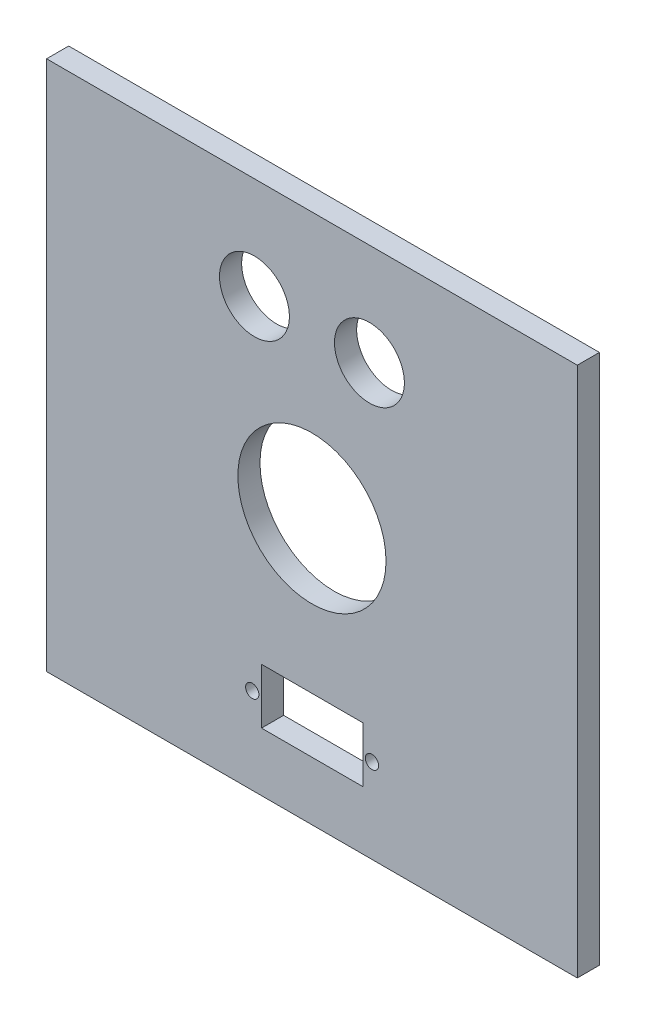
ISO-10303-21;
HEADER;
FILE_DESCRIPTION(('STEP AP214'),'2;1');
FILE_NAME('part.step','',(''),(''),'','','');
FILE_SCHEMA(('AUTOMOTIVE_DESIGN { 1 0 10303 214 1 1 1 1 }'));
ENDSEC;
DATA;
#1=APPLICATION_CONTEXT('core data for automotive mechanical design processes');
#2=APPLICATION_PROTOCOL_DEFINITION('international standard','automotive_design',2000,#1);
#3=PRODUCT_CONTEXT('',#1,'mechanical');
#4=PRODUCT('Part','Part','',(#3));
#5=PRODUCT_RELATED_PRODUCT_CATEGORY('part','',(#4));
#6=PRODUCT_DEFINITION_FORMATION('','',#4);
#7=PRODUCT_DEFINITION_CONTEXT('part definition',#1,'design');
#8=PRODUCT_DEFINITION('design','',#6,#7);
#9=PRODUCT_DEFINITION_SHAPE('','',#8);
#10=(LENGTH_UNIT() NAMED_UNIT(*) SI_UNIT(.MILLI.,.METRE.));
#11=(NAMED_UNIT(*) PLANE_ANGLE_UNIT() SI_UNIT($,.RADIAN.));
#12=(NAMED_UNIT(*) SI_UNIT($,.STERADIAN.) SOLID_ANGLE_UNIT());
#13=UNCERTAINTY_MEASURE_WITH_UNIT(LENGTH_MEASURE(1.E-05),#10,'distance_accuracy_value','');
#14=(GEOMETRIC_REPRESENTATION_CONTEXT(3) GLOBAL_UNCERTAINTY_ASSIGNED_CONTEXT((#13)) GLOBAL_UNIT_ASSIGNED_CONTEXT((#10,
#11,#12)) REPRESENTATION_CONTEXT('',''));
#15=CARTESIAN_POINT('',(0.,0.,0.));
#16=DIRECTION('',(0.,0.,1.));
#17=DIRECTION('',(1.,0.,0.));
#18=AXIS2_PLACEMENT_3D('',#15,#16,#17);
#19=CARTESIAN_POINT('',(0.,0.,5.));
#20=DIRECTION('',(1.,0.,0.));
#21=DIRECTION('',(0.,1.,0.));
#22=AXIS2_PLACEMENT_3D('',#19,#20,#21);
#23=PLANE('',#22);
#24=DIRECTION('',(0.,-1.,0.));
#25=VECTOR('',#24,1.);
#26=CARTESIAN_POINT('',(0.,0.,0.));
#27=LINE('',#26,#25);
#28=CARTESIAN_POINT('',(0.,120.,0.));
#29=VERTEX_POINT('',#28);
#30=CARTESIAN_POINT('',(0.,0.,0.));
#31=VERTEX_POINT('',#30);
#32=EDGE_CURVE('E137',#29,#31,#27,.T.);
#33=ORIENTED_EDGE('',*,*,#32,.T.);
#34=DIRECTION('',(0.,0.,-1.));
#35=VECTOR('',#34,1.);
#36=CARTESIAN_POINT('',(0.,0.,5.));
#37=LINE('',#36,#35);
#38=CARTESIAN_POINT('',(0.,0.,5.));
#39=VERTEX_POINT('',#38);
#40=EDGE_CURVE('E153',#39,#31,#37,.T.);
#41=ORIENTED_EDGE('',*,*,#40,.F.);
#42=DIRECTION('',(0.,-1.,0.));
#43=VECTOR('',#42,1.);
#44=CARTESIAN_POINT('',(0.,0.,5.));
#45=LINE('',#44,#43);
#46=CARTESIAN_POINT('',(0.,120.,5.));
#47=VERTEX_POINT('',#46);
#48=EDGE_CURVE('E126',#47,#39,#45,.T.);
#49=ORIENTED_EDGE('',*,*,#48,.F.);
#50=DIRECTION('',(0.,0.,-1.));
#51=VECTOR('',#50,1.);
#52=CARTESIAN_POINT('',(0.,120.,5.));
#53=LINE('',#52,#51);
#54=EDGE_CURVE('E136',#47,#29,#53,.T.);
#55=ORIENTED_EDGE('',*,*,#54,.T.);
#56=EDGE_LOOP('',(#33,#41,#49,#55));
#57=FACE_BOUND('',#56,.T.);
#58=ADVANCED_FACE('F33',(#57),#23,.F.);
#59=CARTESIAN_POINT('',(0.,0.,5.));
#60=DIRECTION('',(0.,1.,0.));
#61=DIRECTION('',(0.,0.,1.));
#62=AXIS2_PLACEMENT_3D('',#59,#60,#61);
#63=PLANE('',#62);
#64=DIRECTION('',(1.,0.,0.));
#65=VECTOR('',#64,1.);
#66=CARTESIAN_POINT('',(0.,0.,0.));
#67=LINE('',#66,#65);
#68=CARTESIAN_POINT('',(120.,0.,0.));
#69=VERTEX_POINT('',#68);
#70=EDGE_CURVE('E140',#31,#69,#67,.T.);
#71=ORIENTED_EDGE('',*,*,#70,.T.);
#72=DIRECTION('',(0.,0.,-1.));
#73=VECTOR('',#72,1.);
#74=CARTESIAN_POINT('',(120.,0.,5.));
#75=LINE('',#74,#73);
#76=CARTESIAN_POINT('',(120.,0.,5.));
#77=VERTEX_POINT('',#76);
#78=EDGE_CURVE('E150',#77,#69,#75,.T.);
#79=ORIENTED_EDGE('',*,*,#78,.F.);
#80=DIRECTION('',(1.,0.,0.));
#81=VECTOR('',#80,1.);
#82=CARTESIAN_POINT('',(0.,0.,5.));
#83=LINE('',#82,#81);
#84=EDGE_CURVE('E129',#39,#77,#83,.T.);
#85=ORIENTED_EDGE('',*,*,#84,.F.);
#86=ORIENTED_EDGE('',*,*,#40,.T.);
#87=EDGE_LOOP('',(#71,#79,#85,#86));
#88=FACE_BOUND('',#87,.T.);
#89=ADVANCED_FACE('F211',(#88),#63,.F.);
#90=CARTESIAN_POINT('',(120.,0.,5.));
#91=DIRECTION('',(-1.,0.,0.));
#92=DIRECTION('',(0.,-1.,0.));
#93=AXIS2_PLACEMENT_3D('',#90,#91,#92);
#94=PLANE('',#93);
#95=DIRECTION('',(0.,1.,0.));
#96=VECTOR('',#95,1.);
#97=CARTESIAN_POINT('',(120.,0.,0.));
#98=LINE('',#97,#96);
#99=CARTESIAN_POINT('',(120.,120.,0.));
#100=VERTEX_POINT('',#99);
#101=EDGE_CURVE('E142',#69,#100,#98,.T.);
#102=ORIENTED_EDGE('',*,*,#101,.T.);
#103=DIRECTION('',(0.,0.,-1.));
#104=VECTOR('',#103,1.);
#105=CARTESIAN_POINT('',(120.,120.,5.));
#106=LINE('',#105,#104);
#107=CARTESIAN_POINT('',(120.,120.,5.));
#108=VERTEX_POINT('',#107);
#109=EDGE_CURVE('E147',#108,#100,#106,.T.);
#110=ORIENTED_EDGE('',*,*,#109,.F.);
#111=DIRECTION('',(0.,1.,0.));
#112=VECTOR('',#111,1.);
#113=CARTESIAN_POINT('',(120.,0.,5.));
#114=LINE('',#113,#112);
#115=EDGE_CURVE('E132',#77,#108,#114,.T.);
#116=ORIENTED_EDGE('',*,*,#115,.F.);
#117=ORIENTED_EDGE('',*,*,#78,.T.);
#118=EDGE_LOOP('',(#102,#110,#116,#117));
#119=FACE_BOUND('',#118,.T.);
#120=ADVANCED_FACE('F216',(#119),#94,.F.);
#121=CARTESIAN_POINT('',(0.,120.,5.));
#122=DIRECTION('',(0.,-1.,0.));
#123=DIRECTION('',(0.,0.,-1.));
#124=AXIS2_PLACEMENT_3D('',#121,#122,#123);
#125=PLANE('',#124);
#126=DIRECTION('',(-1.,0.,0.));
#127=VECTOR('',#126,1.);
#128=CARTESIAN_POINT('',(0.,120.,0.));
#129=LINE('',#128,#127);
#130=EDGE_CURVE('E130',#100,#29,#129,.T.);
#131=ORIENTED_EDGE('',*,*,#130,.T.);
#132=ORIENTED_EDGE('',*,*,#54,.F.);
#133=DIRECTION('',(-1.,0.,0.));
#134=VECTOR('',#133,1.);
#135=CARTESIAN_POINT('',(0.,120.,5.));
#136=LINE('',#135,#134);
#137=EDGE_CURVE('E134',#108,#47,#136,.T.);
#138=ORIENTED_EDGE('',*,*,#137,.F.);
#139=ORIENTED_EDGE('',*,*,#109,.T.);
#140=EDGE_LOOP('',(#131,#132,#138,#139));
#141=FACE_BOUND('',#140,.T.);
#142=ADVANCED_FACE('F231',(#141),#125,.F.);
#143=CARTESIAN_POINT('',(0.,0.,5.));
#144=DIRECTION('',(0.,0.,-1.));
#145=DIRECTION('',(-1.,0.,0.));
#146=AXIS2_PLACEMENT_3D('',#143,#144,#145);
#147=PLANE('',#146);
#148=CARTESIAN_POINT('',(73.,96.9750196711506,5.));
#149=DIRECTION('',(0.,0.,-1.));
#150=DIRECTION('',(-1.,0.,0.));
#151=AXIS2_PLACEMENT_3D('',#148,#149,#150);
#152=CIRCLE('',#151,7.9);
#153=CARTESIAN_POINT('',(65.1,96.9750196711506,5.));
#154=VERTEX_POINT('',#153);
#155=EDGE_CURVE('E172',#154,#154,#152,.T.);
#156=ORIENTED_EDGE('',*,*,#155,.T.);
#157=EDGE_LOOP('',(#156));
#158=FACE_BOUND('',#157,.T.);
#159=CARTESIAN_POINT('',(47.,96.9750196711506,5.));
#160=DIRECTION('',(0.,0.,-1.));
#161=DIRECTION('',(-1.,0.,0.));
#162=AXIS2_PLACEMENT_3D('',#159,#160,#161);
#163=CIRCLE('',#162,7.9);
#164=CARTESIAN_POINT('',(39.1,96.9750196711506,5.));
#165=VERTEX_POINT('',#164);
#166=EDGE_CURVE('E169',#165,#165,#163,.T.);
#167=ORIENTED_EDGE('',*,*,#166,.T.);
#168=EDGE_LOOP('',(#167));
#169=FACE_BOUND('',#168,.T.);
#170=CARTESIAN_POINT('',(73.5665670645339,19.0996451666253,5.));
#171=DIRECTION('',(0.,0.,-1.));
#172=DIRECTION('',(-1.,0.,0.));
#173=AXIS2_PLACEMENT_3D('',#170,#171,#172);
#174=CIRCLE('',#173,1.49999999999946);
#175=CARTESIAN_POINT('',(72.0665670645344,19.0996451666253,5.));
#176=VERTEX_POINT('',#175);
#177=EDGE_CURVE('E166',#176,#176,#174,.T.);
#178=ORIENTED_EDGE('',*,*,#177,.T.);
#179=EDGE_LOOP('',(#178));
#180=FACE_BOUND('',#179,.T.);
#181=CARTESIAN_POINT('',(46.5000000000001,19.4837500000101,5.));
#182=DIRECTION('',(0.,0.,-1.));
#183=DIRECTION('',(-1.,0.,0.));
#184=AXIS2_PLACEMENT_3D('',#181,#182,#183);
#185=CIRCLE('',#184,1.49999999999691);
#186=CARTESIAN_POINT('',(45.0000000000032,19.4837500000101,5.));
#187=VERTEX_POINT('',#186);
#188=EDGE_CURVE('E165',#187,#187,#185,.T.);
#189=ORIENTED_EDGE('',*,*,#188,.T.);
#190=EDGE_LOOP('',(#189));
#191=FACE_BOUND('',#190,.T.);
#192=DIRECTION('',(-1.,0.,0.));
#193=VECTOR('',#192,1.);
#194=CARTESIAN_POINT('',(0.,13.23375,5.));
#195=LINE('',#194,#193);
#196=CARTESIAN_POINT('',(71.5,13.23375,5.));
#197=VERTEX_POINT('',#196);
#198=CARTESIAN_POINT('',(48.6,13.23375,5.));
#199=VERTEX_POINT('',#198);
#200=EDGE_CURVE('E95',#197,#199,#195,.T.);
#201=ORIENTED_EDGE('',*,*,#200,.T.);
#202=DIRECTION('',(0.,1.,0.));
#203=VECTOR('',#202,1.);
#204=CARTESIAN_POINT('',(48.6,0.,5.));
#205=LINE('',#204,#203);
#206=CARTESIAN_POINT('',(48.6,25.73375,5.));
#207=VERTEX_POINT('',#206);
#208=EDGE_CURVE('E117',#199,#207,#205,.T.);
#209=ORIENTED_EDGE('',*,*,#208,.T.);
#210=DIRECTION('',(1.,0.,0.));
#211=VECTOR('',#210,1.);
#212=CARTESIAN_POINT('',(0.,25.73375,5.));
#213=LINE('',#212,#211);
#214=CARTESIAN_POINT('',(71.5,25.73375,5.));
#215=VERTEX_POINT('',#214);
#216=EDGE_CURVE('E115',#207,#215,#213,.T.);
#217=ORIENTED_EDGE('',*,*,#216,.T.);
#218=DIRECTION('',(0.,-1.,0.));
#219=VECTOR('',#218,1.);
#220=CARTESIAN_POINT('',(71.5,0.,5.));
#221=LINE('',#220,#219);
#222=EDGE_CURVE('E100',#215,#197,#221,.T.);
#223=ORIENTED_EDGE('',*,*,#222,.T.);
#224=EDGE_LOOP('',(#201,#209,#217,#223));
#225=FACE_BOUND('',#224,.T.);
#226=CARTESIAN_POINT('',(60.,60.,5.));
#227=DIRECTION('',(0.,0.,1.));
#228=DIRECTION('',(1.,0.,0.));
#229=AXIS2_PLACEMENT_3D('',#226,#227,#228);
#230=CIRCLE('',#229,16.75);
#231=CARTESIAN_POINT('',(76.75,60.,5.));
#232=VERTEX_POINT('',#231);
#233=EDGE_CURVE('E122',#232,#232,#230,.T.);
#234=ORIENTED_EDGE('',*,*,#233,.F.);
#235=EDGE_LOOP('',(#234));
#236=FACE_BOUND('',#235,.T.);
#237=ORIENTED_EDGE('',*,*,#48,.T.);
#238=ORIENTED_EDGE('',*,*,#84,.T.);
#239=ORIENTED_EDGE('',*,*,#115,.T.);
#240=ORIENTED_EDGE('',*,*,#137,.T.);
#241=EDGE_LOOP('',(#237,#238,#239,#240));
#242=FACE_BOUND('',#241,.T.);
#243=ADVANCED_FACE('F113',(#158,#169,#180,#191,#225,#236,#242),#147,.F.);
#244=CARTESIAN_POINT('',(0.,0.,0.));
#245=DIRECTION('',(0.,0.,-1.));
#246=DIRECTION('',(-1.,0.,0.));
#247=AXIS2_PLACEMENT_3D('',#244,#245,#246);
#248=PLANE('',#247);
#249=CARTESIAN_POINT('',(73.,96.9750196711506,0.));
#250=DIRECTION('',(0.,0.,-1.));
#251=DIRECTION('',(-1.,0.,0.));
#252=AXIS2_PLACEMENT_3D('',#249,#250,#251);
#253=CIRCLE('',#252,7.9);
#254=CARTESIAN_POINT('',(65.1,96.9750196711506,0.));
#255=VERTEX_POINT('',#254);
#256=EDGE_CURVE('E36',#255,#255,#253,.T.);
#257=ORIENTED_EDGE('',*,*,#256,.F.);
#258=EDGE_LOOP('',(#257));
#259=FACE_BOUND('',#258,.T.);
#260=CARTESIAN_POINT('',(47.,96.9750196711506,0.));
#261=DIRECTION('',(0.,0.,-1.));
#262=DIRECTION('',(-1.,0.,0.));
#263=AXIS2_PLACEMENT_3D('',#260,#261,#262);
#264=CIRCLE('',#263,7.9);
#265=CARTESIAN_POINT('',(39.1,96.9750196711506,0.));
#266=VERTEX_POINT('',#265);
#267=EDGE_CURVE('E170',#266,#266,#264,.T.);
#268=ORIENTED_EDGE('',*,*,#267,.F.);
#269=EDGE_LOOP('',(#268));
#270=FACE_BOUND('',#269,.T.);
#271=CARTESIAN_POINT('',(73.5665670645339,19.0996451666253,0.));
#272=DIRECTION('',(0.,0.,-1.));
#273=DIRECTION('',(-1.,0.,0.));
#274=AXIS2_PLACEMENT_3D('',#271,#272,#273);
#275=CIRCLE('',#274,1.49999999999946);
#276=CARTESIAN_POINT('',(72.0665670645344,19.0996451666253,0.));
#277=VERTEX_POINT('',#276);
#278=EDGE_CURVE('E167',#277,#277,#275,.T.);
#279=ORIENTED_EDGE('',*,*,#278,.F.);
#280=EDGE_LOOP('',(#279));
#281=FACE_BOUND('',#280,.T.);
#282=CARTESIAN_POINT('',(46.5000000000001,19.4837500000101,0.));
#283=DIRECTION('',(0.,0.,-1.));
#284=DIRECTION('',(-1.,0.,0.));
#285=AXIS2_PLACEMENT_3D('',#282,#283,#284);
#286=CIRCLE('',#285,1.49999999999691);
#287=CARTESIAN_POINT('',(45.0000000000032,19.4837500000101,0.));
#288=VERTEX_POINT('',#287);
#289=EDGE_CURVE('E162',#288,#288,#286,.T.);
#290=ORIENTED_EDGE('',*,*,#289,.F.);
#291=EDGE_LOOP('',(#290));
#292=FACE_BOUND('',#291,.T.);
#293=DIRECTION('',(0.,1.,0.));
#294=VECTOR('',#293,1.);
#295=CARTESIAN_POINT('',(48.6,0.,0.));
#296=LINE('',#295,#294);
#297=CARTESIAN_POINT('',(48.6,13.23375,0.));
#298=VERTEX_POINT('',#297);
#299=CARTESIAN_POINT('',(48.6,25.73375,0.));
#300=VERTEX_POINT('',#299);
#301=EDGE_CURVE('E11',#298,#300,#296,.T.);
#302=ORIENTED_EDGE('',*,*,#301,.F.);
#303=DIRECTION('',(-1.,0.,0.));
#304=VECTOR('',#303,1.);
#305=CARTESIAN_POINT('',(0.,13.23375,0.));
#306=LINE('',#305,#304);
#307=CARTESIAN_POINT('',(71.5,13.23375,0.));
#308=VERTEX_POINT('',#307);
#309=EDGE_CURVE('E156',#308,#298,#306,.T.);
#310=ORIENTED_EDGE('',*,*,#309,.F.);
#311=DIRECTION('',(0.,-1.,0.));
#312=VECTOR('',#311,1.);
#313=CARTESIAN_POINT('',(71.5,0.,0.));
#314=LINE('',#313,#312);
#315=CARTESIAN_POINT('',(71.5,25.73375,0.));
#316=VERTEX_POINT('',#315);
#317=EDGE_CURVE('E108',#316,#308,#314,.T.);
#318=ORIENTED_EDGE('',*,*,#317,.F.);
#319=DIRECTION('',(1.,0.,0.));
#320=VECTOR('',#319,1.);
#321=CARTESIAN_POINT('',(0.,25.73375,0.));
#322=LINE('',#321,#320);
#323=EDGE_CURVE('E41',#300,#316,#322,.T.);
#324=ORIENTED_EDGE('',*,*,#323,.F.);
#325=EDGE_LOOP('',(#302,#310,#318,#324));
#326=FACE_BOUND('',#325,.T.);
#327=CARTESIAN_POINT('',(60.,60.,0.));
#328=DIRECTION('',(0.,0.,-1.));
#329=DIRECTION('',(-1.,0.,0.));
#330=AXIS2_PLACEMENT_3D('',#327,#328,#329);
#331=CIRCLE('',#330,16.75);
#332=CARTESIAN_POINT('',(43.25,60.,0.));
#333=VERTEX_POINT('',#332);
#334=EDGE_CURVE('E125',#333,#333,#331,.T.);
#335=ORIENTED_EDGE('',*,*,#334,.F.);
#336=EDGE_LOOP('',(#335));
#337=FACE_BOUND('',#336,.T.);
#338=ORIENTED_EDGE('',*,*,#32,.F.);
#339=ORIENTED_EDGE('',*,*,#130,.F.);
#340=ORIENTED_EDGE('',*,*,#101,.F.);
#341=ORIENTED_EDGE('',*,*,#70,.F.);
#342=EDGE_LOOP('',(#338,#339,#340,#341));
#343=FACE_BOUND('',#342,.T.);
#344=ADVANCED_FACE('F195',(#259,#270,#281,#292,#326,#337,#343),#248,.T.);
#345=CARTESIAN_POINT('',(60.,60.,-8.));
#346=DIRECTION('',(0.,0.,1.));
#347=DIRECTION('',(1.,0.,0.));
#348=AXIS2_PLACEMENT_3D('',#345,#346,#347);
#349=CYLINDRICAL_SURFACE('',#348,16.75);
#350=ORIENTED_EDGE('',*,*,#334,.T.);
#351=EDGE_LOOP('',(#350));
#352=FACE_BOUND('',#351,.T.);
#353=ORIENTED_EDGE('',*,*,#233,.T.);
#354=EDGE_LOOP('',(#353));
#355=FACE_BOUND('',#354,.T.);
#356=ADVANCED_FACE('F200',(#352,#355),#349,.F.);
#357=CARTESIAN_POINT('',(48.6,25.73375,-29.));
#358=DIRECTION('',(-1.,0.,0.));
#359=DIRECTION('',(0.,0.,1.));
#360=AXIS2_PLACEMENT_3D('',#357,#358,#359);
#361=PLANE('',#360);
#362=DIRECTION('',(0.,0.,1.));
#363=VECTOR('',#362,1.);
#364=CARTESIAN_POINT('',(48.6,13.23375,-29.));
#365=LINE('',#364,#363);
#366=EDGE_CURVE('E49',#298,#199,#365,.T.);
#367=ORIENTED_EDGE('',*,*,#366,.F.);
#368=ORIENTED_EDGE('',*,*,#301,.T.);
#369=DIRECTION('',(0.,0.,1.));
#370=VECTOR('',#369,1.);
#371=CARTESIAN_POINT('',(48.6,25.73375,-29.));
#372=LINE('',#371,#370);
#373=EDGE_CURVE('E101',#300,#207,#372,.T.);
#374=ORIENTED_EDGE('',*,*,#373,.T.);
#375=ORIENTED_EDGE('',*,*,#208,.F.);
#376=EDGE_LOOP('',(#367,#368,#374,#375));
#377=FACE_BOUND('',#376,.T.);
#378=ADVANCED_FACE('F198',(#377),#361,.F.);
#379=CARTESIAN_POINT('',(48.6,25.73375,-29.));
#380=DIRECTION('',(0.,1.,0.));
#381=DIRECTION('',(-1.,0.,0.));
#382=AXIS2_PLACEMENT_3D('',#379,#380,#381);
#383=PLANE('',#382);
#384=ORIENTED_EDGE('',*,*,#373,.F.);
#385=ORIENTED_EDGE('',*,*,#323,.T.);
#386=DIRECTION('',(0.,0.,1.));
#387=VECTOR('',#386,1.);
#388=CARTESIAN_POINT('',(71.5,25.73375,-29.));
#389=LINE('',#388,#387);
#390=EDGE_CURVE('E110',#316,#215,#389,.T.);
#391=ORIENTED_EDGE('',*,*,#390,.T.);
#392=ORIENTED_EDGE('',*,*,#216,.F.);
#393=EDGE_LOOP('',(#384,#385,#391,#392));
#394=FACE_BOUND('',#393,.T.);
#395=ADVANCED_FACE('F191',(#394),#383,.F.);
#396=CARTESIAN_POINT('',(71.5,25.73375,-29.));
#397=DIRECTION('',(1.,0.,0.));
#398=DIRECTION('',(0.,0.,-1.));
#399=AXIS2_PLACEMENT_3D('',#396,#397,#398);
#400=PLANE('',#399);
#401=ORIENTED_EDGE('',*,*,#390,.F.);
#402=ORIENTED_EDGE('',*,*,#317,.T.);
#403=DIRECTION('',(0.,0.,1.));
#404=VECTOR('',#403,1.);
#405=CARTESIAN_POINT('',(71.5,13.23375,-29.));
#406=LINE('',#405,#404);
#407=EDGE_CURVE('E54',#308,#197,#406,.T.);
#408=ORIENTED_EDGE('',*,*,#407,.T.);
#409=ORIENTED_EDGE('',*,*,#222,.F.);
#410=EDGE_LOOP('',(#401,#402,#408,#409));
#411=FACE_BOUND('',#410,.T.);
#412=ADVANCED_FACE('F105',(#411),#400,.F.);
#413=CARTESIAN_POINT('',(48.6,13.23375,-29.));
#414=DIRECTION('',(0.,-1.,0.));
#415=DIRECTION('',(1.,0.,0.));
#416=AXIS2_PLACEMENT_3D('',#413,#414,#415);
#417=PLANE('',#416);
#418=ORIENTED_EDGE('',*,*,#407,.F.);
#419=ORIENTED_EDGE('',*,*,#309,.T.);
#420=ORIENTED_EDGE('',*,*,#366,.T.);
#421=ORIENTED_EDGE('',*,*,#200,.F.);
#422=EDGE_LOOP('',(#418,#419,#420,#421));
#423=FACE_BOUND('',#422,.T.);
#424=ADVANCED_FACE('F96',(#423),#417,.F.);
#425=CARTESIAN_POINT('',(46.5000000000001,19.4837500000101,-29.));
#426=DIRECTION('',(0.,0.,1.));
#427=DIRECTION('',(1.,0.,0.));
#428=AXIS2_PLACEMENT_3D('',#425,#426,#427);
#429=CYLINDRICAL_SURFACE('',#428,1.49999999999691);
#430=ORIENTED_EDGE('',*,*,#289,.T.);
#431=EDGE_LOOP('',(#430));
#432=FACE_BOUND('',#431,.T.);
#433=ORIENTED_EDGE('',*,*,#188,.F.);
#434=EDGE_LOOP('',(#433));
#435=FACE_BOUND('',#434,.T.);
#436=ADVANCED_FACE('F253',(#432,#435),#429,.F.);
#437=CARTESIAN_POINT('',(73.5665670645339,19.0996451666253,-29.));
#438=DIRECTION('',(0.,0.,1.));
#439=DIRECTION('',(1.,0.,0.));
#440=AXIS2_PLACEMENT_3D('',#437,#438,#439);
#441=CYLINDRICAL_SURFACE('',#440,1.49999999999946);
#442=ORIENTED_EDGE('',*,*,#278,.T.);
#443=EDGE_LOOP('',(#442));
#444=FACE_BOUND('',#443,.T.);
#445=ORIENTED_EDGE('',*,*,#177,.F.);
#446=EDGE_LOOP('',(#445));
#447=FACE_BOUND('',#446,.T.);
#448=ADVANCED_FACE('F255',(#444,#447),#441,.F.);
#449=CARTESIAN_POINT('',(47.,96.9750196711506,-28.));
#450=DIRECTION('',(0.,0.,1.));
#451=DIRECTION('',(1.,0.,0.));
#452=AXIS2_PLACEMENT_3D('',#449,#450,#451);
#453=CYLINDRICAL_SURFACE('',#452,7.9);
#454=ORIENTED_EDGE('',*,*,#267,.T.);
#455=EDGE_LOOP('',(#454));
#456=FACE_BOUND('',#455,.T.);
#457=ORIENTED_EDGE('',*,*,#166,.F.);
#458=EDGE_LOOP('',(#457));
#459=FACE_BOUND('',#458,.T.);
#460=ADVANCED_FACE('F262',(#456,#459),#453,.F.);
#461=CARTESIAN_POINT('',(73.,96.9750196711506,-28.));
#462=DIRECTION('',(0.,0.,1.));
#463=DIRECTION('',(1.,0.,0.));
#464=AXIS2_PLACEMENT_3D('',#461,#462,#463);
#465=CYLINDRICAL_SURFACE('',#464,7.9);
#466=ORIENTED_EDGE('',*,*,#256,.T.);
#467=EDGE_LOOP('',(#466));
#468=FACE_BOUND('',#467,.T.);
#469=ORIENTED_EDGE('',*,*,#155,.F.);
#470=EDGE_LOOP('',(#469));
#471=FACE_BOUND('',#470,.T.);
#472=ADVANCED_FACE('F307',(#468,#471),#465,.F.);
#473=CLOSED_SHELL('',(#58,#89,#120,#142,#243,#344,#356,#378,#395,#412,#424,#436,#448,#460,#472));
#474=MANIFOLD_SOLID_BREP('B2',#473);
#475=ADVANCED_BREP_SHAPE_REPRESENTATION('',(#18,#474),#14);
#476=SHAPE_DEFINITION_REPRESENTATION(#9,#475);
ENDSEC;
END-ISO-10303-21;
